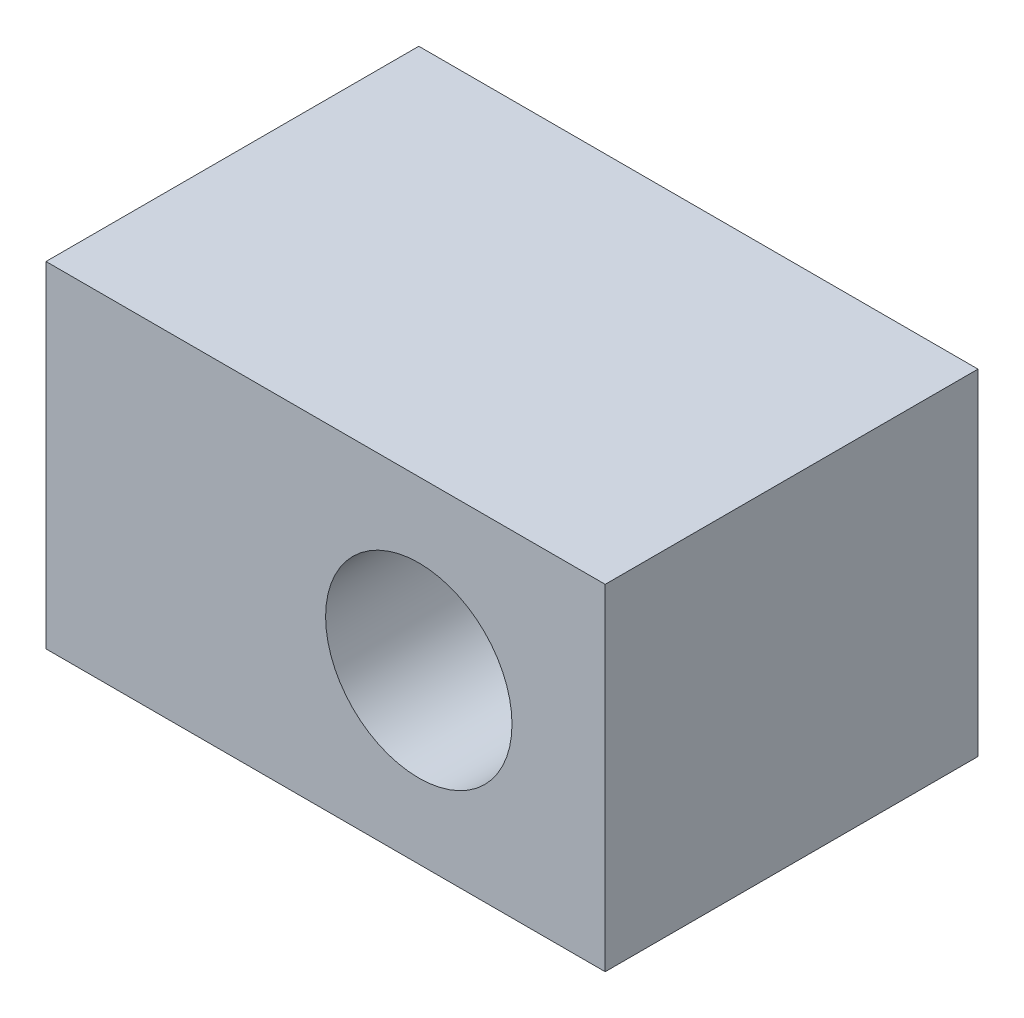
ISO-10303-21;
HEADER;
FILE_DESCRIPTION(('STEP AP214'),'2;1');
FILE_NAME('part.step','',(''),(''),'','','');
FILE_SCHEMA(('AUTOMOTIVE_DESIGN { 1 0 10303 214 1 1 1 1 }'));
ENDSEC;
DATA;
#1=APPLICATION_CONTEXT('core data for automotive mechanical design processes');
#2=APPLICATION_PROTOCOL_DEFINITION('international standard','automotive_design',2000,#1);
#3=PRODUCT_CONTEXT('',#1,'mechanical');
#4=PRODUCT('Part','Part','',(#3));
#5=PRODUCT_RELATED_PRODUCT_CATEGORY('part','',(#4));
#6=PRODUCT_DEFINITION_FORMATION('','',#4);
#7=PRODUCT_DEFINITION_CONTEXT('part definition',#1,'design');
#8=PRODUCT_DEFINITION('design','',#6,#7);
#9=PRODUCT_DEFINITION_SHAPE('','',#8);
#10=(LENGTH_UNIT() NAMED_UNIT(*) SI_UNIT(.MILLI.,.METRE.));
#11=(NAMED_UNIT(*) PLANE_ANGLE_UNIT() SI_UNIT($,.RADIAN.));
#12=(NAMED_UNIT(*) SI_UNIT($,.STERADIAN.) SOLID_ANGLE_UNIT());
#13=UNCERTAINTY_MEASURE_WITH_UNIT(LENGTH_MEASURE(1.E-05),#10,'distance_accuracy_value','');
#14=(GEOMETRIC_REPRESENTATION_CONTEXT(3) GLOBAL_UNCERTAINTY_ASSIGNED_CONTEXT((#13)) GLOBAL_UNIT_ASSIGNED_CONTEXT((#10,
#11,#12)) REPRESENTATION_CONTEXT('',''));
#15=CARTESIAN_POINT('',(0.,0.,0.));
#16=DIRECTION('',(0.,0.,1.));
#17=DIRECTION('',(1.,0.,0.));
#18=AXIS2_PLACEMENT_3D('',#15,#16,#17);
#19=CARTESIAN_POINT('',(9.525,-5.715,12.7));
#20=DIRECTION('',(-1.,0.,0.));
#21=DIRECTION('',(0.,0.,1.));
#22=AXIS2_PLACEMENT_3D('',#19,#20,#21);
#23=PLANE('',#22);
#24=DIRECTION('',(0.,1.,0.));
#25=VECTOR('',#24,1.);
#26=CARTESIAN_POINT('',(9.525,-5.715,0.));
#27=LINE('',#26,#25);
#28=CARTESIAN_POINT('',(9.525,-5.715,0.));
#29=VERTEX_POINT('',#28);
#30=CARTESIAN_POINT('',(9.525,5.715,0.));
#31=VERTEX_POINT('',#30);
#32=EDGE_CURVE('E131',#29,#31,#27,.T.);
#33=ORIENTED_EDGE('',*,*,#32,.T.);
#34=DIRECTION('',(0.,0.,-1.));
#35=VECTOR('',#34,1.);
#36=CARTESIAN_POINT('',(9.525,5.715,12.7));
#37=LINE('',#36,#35);
#38=CARTESIAN_POINT('',(9.525,5.715,12.7));
#39=VERTEX_POINT('',#38);
#40=EDGE_CURVE('E11',#39,#31,#37,.T.);
#41=ORIENTED_EDGE('',*,*,#40,.F.);
#42=DIRECTION('',(0.,1.,0.));
#43=VECTOR('',#42,1.);
#44=CARTESIAN_POINT('',(9.525,-5.715,12.7));
#45=LINE('',#44,#43);
#46=CARTESIAN_POINT('',(9.525,-5.715,12.7));
#47=VERTEX_POINT('',#46);
#48=EDGE_CURVE('E133',#47,#39,#45,.T.);
#49=ORIENTED_EDGE('',*,*,#48,.F.);
#50=DIRECTION('',(0.,0.,-1.));
#51=VECTOR('',#50,1.);
#52=CARTESIAN_POINT('',(9.525,-5.715,12.7));
#53=LINE('',#52,#51);
#54=EDGE_CURVE('E143',#47,#29,#53,.T.);
#55=ORIENTED_EDGE('',*,*,#54,.T.);
#56=EDGE_LOOP('',(#33,#41,#49,#55));
#57=FACE_BOUND('',#56,.T.);
#58=ADVANCED_FACE('F55',(#57),#23,.F.);
#59=CARTESIAN_POINT('',(-9.525,5.715,12.7));
#60=DIRECTION('',(0.,-1.,0.));
#61=DIRECTION('',(0.,0.,-1.));
#62=AXIS2_PLACEMENT_3D('',#59,#60,#61);
#63=PLANE('',#62);
#64=DIRECTION('',(-1.,0.,0.));
#65=VECTOR('',#64,1.);
#66=CARTESIAN_POINT('',(-9.525,5.715,0.));
#67=LINE('',#66,#65);
#68=CARTESIAN_POINT('',(-9.525,5.715,0.));
#69=VERTEX_POINT('',#68);
#70=EDGE_CURVE('E147',#31,#69,#67,.T.);
#71=ORIENTED_EDGE('',*,*,#70,.T.);
#72=DIRECTION('',(0.,0.,-1.));
#73=VECTOR('',#72,1.);
#74=CARTESIAN_POINT('',(-9.525,5.715,12.7));
#75=LINE('',#74,#73);
#76=CARTESIAN_POINT('',(-9.525,5.715,12.7));
#77=VERTEX_POINT('',#76);
#78=EDGE_CURVE('E64',#77,#69,#75,.T.);
#79=ORIENTED_EDGE('',*,*,#78,.F.);
#80=DIRECTION('',(-1.,0.,0.));
#81=VECTOR('',#80,1.);
#82=CARTESIAN_POINT('',(-9.525,5.715,12.7));
#83=LINE('',#82,#81);
#84=EDGE_CURVE('E103',#39,#77,#83,.T.);
#85=ORIENTED_EDGE('',*,*,#84,.F.);
#86=ORIENTED_EDGE('',*,*,#40,.T.);
#87=EDGE_LOOP('',(#71,#79,#85,#86));
#88=FACE_BOUND('',#87,.T.);
#89=ADVANCED_FACE('F178',(#88),#63,.F.);
#90=CARTESIAN_POINT('',(-9.525,-5.715,12.7));
#91=DIRECTION('',(1.,0.,0.));
#92=DIRECTION('',(0.,0.,-1.));
#93=AXIS2_PLACEMENT_3D('',#90,#91,#92);
#94=PLANE('',#93);
#95=CARTESIAN_POINT('',(-9.52500000000001,0.,6.35));
#96=DIRECTION('',(-1.,0.,0.));
#97=DIRECTION('',(0.,0.,1.));
#98=AXIS2_PLACEMENT_3D('',#95,#96,#97);
#99=CIRCLE('',#98,2.01929999999999);
#100=CARTESIAN_POINT('',(-9.52500000000001,0.,8.36929999999999));
#101=VERTEX_POINT('',#100);
#102=EDGE_CURVE('E119',#101,#101,#99,.T.);
#103=ORIENTED_EDGE('',*,*,#102,.F.);
#104=EDGE_LOOP('',(#103));
#105=FACE_BOUND('',#104,.T.);
#106=DIRECTION('',(0.,-1.,0.));
#107=VECTOR('',#106,1.);
#108=CARTESIAN_POINT('',(-9.525,-5.715,0.));
#109=LINE('',#108,#107);
#110=CARTESIAN_POINT('',(-9.525,-5.715,0.));
#111=VERTEX_POINT('',#110);
#112=EDGE_CURVE('E90',#69,#111,#109,.T.);
#113=ORIENTED_EDGE('',*,*,#112,.T.);
#114=DIRECTION('',(0.,0.,-1.));
#115=VECTOR('',#114,1.);
#116=CARTESIAN_POINT('',(-9.525,-5.715,12.7));
#117=LINE('',#116,#115);
#118=CARTESIAN_POINT('',(-9.525,-5.715,12.7));
#119=VERTEX_POINT('',#118);
#120=EDGE_CURVE('E156',#119,#111,#117,.T.);
#121=ORIENTED_EDGE('',*,*,#120,.F.);
#122=DIRECTION('',(0.,-1.,0.));
#123=VECTOR('',#122,1.);
#124=CARTESIAN_POINT('',(-9.525,-5.715,12.7));
#125=LINE('',#124,#123);
#126=EDGE_CURVE('E138',#77,#119,#125,.T.);
#127=ORIENTED_EDGE('',*,*,#126,.F.);
#128=ORIENTED_EDGE('',*,*,#78,.T.);
#129=EDGE_LOOP('',(#113,#121,#127,#128));
#130=FACE_BOUND('',#129,.T.);
#131=ADVANCED_FACE('F160',(#105,#130),#94,.F.);
#132=CARTESIAN_POINT('',(-9.525,-5.715,12.7));
#133=DIRECTION('',(0.,1.,0.));
#134=DIRECTION('',(0.,0.,1.));
#135=AXIS2_PLACEMENT_3D('',#132,#133,#134);
#136=PLANE('',#135);
#137=DIRECTION('',(1.,0.,0.));
#138=VECTOR('',#137,1.);
#139=CARTESIAN_POINT('',(-9.525,-5.715,0.));
#140=LINE('',#139,#138);
#141=EDGE_CURVE('E96',#111,#29,#140,.T.);
#142=ORIENTED_EDGE('',*,*,#141,.T.);
#143=ORIENTED_EDGE('',*,*,#54,.F.);
#144=DIRECTION('',(1.,0.,0.));
#145=VECTOR('',#144,1.);
#146=CARTESIAN_POINT('',(-9.525,-5.715,12.7));
#147=LINE('',#146,#145);
#148=EDGE_CURVE('E72',#119,#47,#147,.T.);
#149=ORIENTED_EDGE('',*,*,#148,.F.);
#150=ORIENTED_EDGE('',*,*,#120,.T.);
#151=EDGE_LOOP('',(#142,#143,#149,#150));
#152=FACE_BOUND('',#151,.T.);
#153=ADVANCED_FACE('F167',(#152),#136,.F.);
#154=CARTESIAN_POINT('',(0.,0.,12.7));
#155=DIRECTION('',(0.,0.,-1.));
#156=DIRECTION('',(-1.,0.,0.));
#157=AXIS2_PLACEMENT_3D('',#154,#155,#156);
#158=PLANE('',#157);
#159=CARTESIAN_POINT('',(3.175,0.,12.7));
#160=DIRECTION('',(0.,0.,1.));
#161=DIRECTION('',(1.,0.,0.));
#162=AXIS2_PLACEMENT_3D('',#159,#160,#161);
#163=CIRCLE('',#162,3.175);
#164=CARTESIAN_POINT('',(6.35,0.,12.7));
#165=VERTEX_POINT('',#164);
#166=EDGE_CURVE('E118',#165,#165,#163,.T.);
#167=ORIENTED_EDGE('',*,*,#166,.F.);
#168=EDGE_LOOP('',(#167));
#169=FACE_BOUND('',#168,.T.);
#170=ORIENTED_EDGE('',*,*,#48,.T.);
#171=ORIENTED_EDGE('',*,*,#84,.T.);
#172=ORIENTED_EDGE('',*,*,#126,.T.);
#173=ORIENTED_EDGE('',*,*,#148,.T.);
#174=EDGE_LOOP('',(#170,#171,#172,#173));
#175=FACE_BOUND('',#174,.T.);
#176=ADVANCED_FACE('F169',(#169,#175),#158,.F.);
#177=CARTESIAN_POINT('',(0.,0.,0.));
#178=DIRECTION('',(0.,0.,-1.));
#179=DIRECTION('',(-1.,0.,0.));
#180=AXIS2_PLACEMENT_3D('',#177,#178,#179);
#181=PLANE('',#180);
#182=CARTESIAN_POINT('',(3.175,0.,0.));
#183=DIRECTION('',(0.,0.,1.));
#184=DIRECTION('',(1.,0.,0.));
#185=AXIS2_PLACEMENT_3D('',#182,#183,#184);
#186=CIRCLE('',#185,3.175);
#187=CARTESIAN_POINT('',(6.35,0.,0.));
#188=VERTEX_POINT('',#187);
#189=EDGE_CURVE('E124',#188,#188,#186,.T.);
#190=ORIENTED_EDGE('',*,*,#189,.T.);
#191=EDGE_LOOP('',(#190));
#192=FACE_BOUND('',#191,.T.);
#193=ORIENTED_EDGE('',*,*,#32,.F.);
#194=ORIENTED_EDGE('',*,*,#141,.F.);
#195=ORIENTED_EDGE('',*,*,#112,.F.);
#196=ORIENTED_EDGE('',*,*,#70,.F.);
#197=EDGE_LOOP('',(#193,#194,#195,#196));
#198=FACE_BOUND('',#197,.T.);
#199=ADVANCED_FACE('F163',(#192,#198),#181,.T.);
#200=CARTESIAN_POINT('',(3.175,0.,0.));
#201=DIRECTION('',(0.,0.,1.));
#202=DIRECTION('',(1.,0.,0.));
#203=AXIS2_PLACEMENT_3D('',#200,#201,#202);
#204=CYLINDRICAL_SURFACE('',#203,3.175);
#205=ORIENTED_EDGE('',*,*,#189,.F.);
#206=EDGE_LOOP('',(#205));
#207=FACE_BOUND('',#206,.T.);
#208=ORIENTED_EDGE('',*,*,#166,.T.);
#209=EDGE_LOOP('',(#208));
#210=FACE_BOUND('',#209,.T.);
#211=ADVANCED_FACE('F111',(#207,#210),#204,.F.);
#212=CARTESIAN_POINT('',(-2.06756000000001,0.,6.35));
#213=DIRECTION('',(-1.,0.,0.));
#214=DIRECTION('',(0.,0.,1.));
#215=AXIS2_PLACEMENT_3D('',#212,#213,#214);
#216=CONICAL_SURFACE('',#215,2.01929999999999,1.02974425867665);
#217=CARTESIAN_POINT('',(-0.85424215199765,0.,6.35));
#218=VERTEX_POINT('',#217);
#219=VERTEX_LOOP('',#218);
#220=FACE_BOUND('',#219,.T.);
#221=CARTESIAN_POINT('',(-2.06756000000001,0.,6.35));
#222=DIRECTION('',(-1.,0.,0.));
#223=DIRECTION('',(0.,0.,1.));
#224=AXIS2_PLACEMENT_3D('',#221,#222,#223);
#225=CIRCLE('',#224,2.01929999999999);
#226=CARTESIAN_POINT('',(-2.06756000000001,0.,8.36929999999999));
#227=VERTEX_POINT('',#226);
#228=EDGE_CURVE('E115',#227,#227,#225,.T.);
#229=ORIENTED_EDGE('',*,*,#228,.T.);
#230=EDGE_LOOP('',(#229));
#231=FACE_BOUND('',#230,.T.);
#232=ADVANCED_FACE('F107',(#220,#231),#216,.F.);
#233=CARTESIAN_POINT('',(-9.525,0.,6.35));
#234=DIRECTION('',(-1.,0.,0.));
#235=DIRECTION('',(0.,0.,1.));
#236=AXIS2_PLACEMENT_3D('',#233,#234,#235);
#237=CYLINDRICAL_SURFACE('',#236,2.01929999999999);
#238=ORIENTED_EDGE('',*,*,#228,.F.);
#239=EDGE_LOOP('',(#238));
#240=FACE_BOUND('',#239,.T.);
#241=ORIENTED_EDGE('',*,*,#102,.T.);
#242=EDGE_LOOP('',(#241));
#243=FACE_BOUND('',#242,.T.);
#244=ADVANCED_FACE('F110',(#240,#243),#237,.F.);
#245=CLOSED_SHELL('',(#58,#89,#131,#153,#176,#199,#211,#232,#244));
#246=MANIFOLD_SOLID_BREP('B2',#245);
#247=ADVANCED_BREP_SHAPE_REPRESENTATION('',(#18,#246),#14);
#248=SHAPE_DEFINITION_REPRESENTATION(#9,#247);
ENDSEC;
END-ISO-10303-21;
